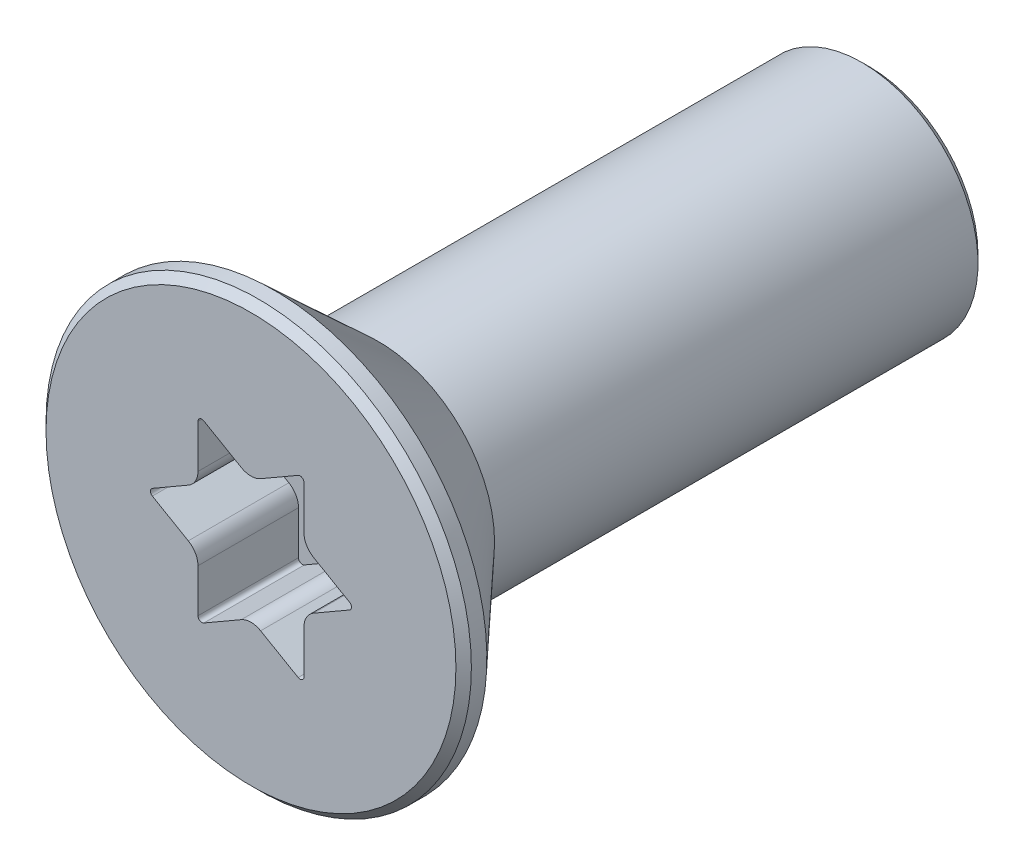
ISO-10303-21;
HEADER;
FILE_DESCRIPTION(('STEP AP214'),'2;1');
FILE_NAME('part.step','',(''),(''),'','','');
FILE_SCHEMA(('AUTOMOTIVE_DESIGN { 1 0 10303 214 1 1 1 1 }'));
ENDSEC;
DATA;
#1=APPLICATION_CONTEXT('core data for automotive mechanical design processes');
#2=APPLICATION_PROTOCOL_DEFINITION('international standard','automotive_design',2000,#1);
#3=PRODUCT_CONTEXT('',#1,'mechanical');
#4=PRODUCT('Part','Part','',(#3));
#5=PRODUCT_RELATED_PRODUCT_CATEGORY('part','',(#4));
#6=PRODUCT_DEFINITION_FORMATION('','',#4);
#7=PRODUCT_DEFINITION_CONTEXT('part definition',#1,'design');
#8=PRODUCT_DEFINITION('design','',#6,#7);
#9=PRODUCT_DEFINITION_SHAPE('','',#8);
#10=(LENGTH_UNIT() NAMED_UNIT(*) SI_UNIT(.MILLI.,.METRE.));
#11=(NAMED_UNIT(*) PLANE_ANGLE_UNIT() SI_UNIT($,.RADIAN.));
#12=(NAMED_UNIT(*) SI_UNIT($,.STERADIAN.) SOLID_ANGLE_UNIT());
#13=UNCERTAINTY_MEASURE_WITH_UNIT(LENGTH_MEASURE(1.E-05),#10,'distance_accuracy_value','');
#14=(GEOMETRIC_REPRESENTATION_CONTEXT(3) GLOBAL_UNCERTAINTY_ASSIGNED_CONTEXT((#13)) GLOBAL_UNIT_ASSIGNED_CONTEXT((#10,
#11,#12)) REPRESENTATION_CONTEXT('',''));
#15=CARTESIAN_POINT('',(0.,0.,0.));
#16=DIRECTION('',(0.,0.,1.));
#17=DIRECTION('',(1.,0.,0.));
#18=AXIS2_PLACEMENT_3D('',#15,#16,#17);
#19=CARTESIAN_POINT('',(7.2,-9.399999999999,97.45));
#20=DIRECTION('',(0.,0.,1.));
#21=DIRECTION('',(1.,0.,0.));
#22=AXIS2_PLACEMENT_3D('',#19,#20,#21);
#23=PLANE('',#22);
#24=CARTESIAN_POINT('',(7.2,-8.331902001999,97.45));
#25=DIRECTION('',(0.,0.,1.));
#26=DIRECTION('',(1.,0.,0.));
#27=AXIS2_PLACEMENT_3D('',#24,#25,#26);
#28=CIRCLE('',#27,0.25);
#29=CARTESIAN_POINT('',(7.07499999999906,-8.54840835294442,97.45));
#30=VERTEX_POINT('',#29);
#31=CARTESIAN_POINT('',(7.32500000000035,-8.54840835294476,97.45));
#32=VERTEX_POINT('',#31);
#33=EDGE_CURVE('E252',#30,#32,#28,.T.);
#34=ORIENTED_EDGE('',*,*,#33,.F.);
#35=DIRECTION('',(-0.866025403784386,0.500000000000092,0.));
#36=VECTOR('',#35,1.);
#37=CARTESIAN_POINT('',(6.832420150552,-8.408354811566,97.45));
#38=LINE('',#37,#36);
#39=CARTESIAN_POINT('',(6.58984030110506,-8.26830127018779,97.45));
#40=VERTEX_POINT('',#39);
#41=EDGE_CURVE('E348',#30,#40,#38,.T.);
#42=ORIENTED_EDGE('',*,*,#41,.T.);
#43=CARTESIAN_POINT('',(6.564840301107,-8.311602540378,97.45));
#44=DIRECTION('',(0.,0.,1.));
#45=DIRECTION('',(1.,0.,0.));
#46=AXIS2_PLACEMENT_3D('',#43,#44,#45);
#47=CIRCLE('',#46,0.05);
#48=CARTESIAN_POINT('',(6.514840301107,-8.3116025391075,97.45));
#49=VERTEX_POINT('',#48);
#50=EDGE_CURVE('E248',#40,#49,#47,.T.);
#51=ORIENTED_EDGE('',*,*,#50,.T.);
#52=DIRECTION('',(0.,1.,0.));
#53=VECTOR('',#52,1.);
#54=CARTESIAN_POINT('',(6.514840301107,-8.59170961551,97.45));
#55=LINE('',#54,#53);
#56=CARTESIAN_POINT('',(6.514840301107,-8.871816705891,97.45));
#57=VERTEX_POINT('',#56);
#58=EDGE_CURVE('E251',#57,#49,#55,.T.);
#59=ORIENTED_EDGE('',*,*,#58,.F.);
#60=CARTESIAN_POINT('',(6.264840301107,-8.871816705891,97.45));
#61=DIRECTION('',(0.,0.,1.));
#62=DIRECTION('',(1.,0.,0.));
#63=AXIS2_PLACEMENT_3D('',#60,#61,#62);
#64=CIRCLE('',#63,0.25);
#65=CARTESIAN_POINT('',(6.38984030110702,-9.08832305683717,97.45));
#66=VERTEX_POINT('',#65);
#67=EDGE_CURVE('E244',#66,#57,#64,.T.);
#68=ORIENTED_EDGE('',*,*,#67,.F.);
#69=DIRECTION('',(-0.866025403784609,-0.499999999999705,0.));
#70=VECTOR('',#69,1.);
#71=CARTESIAN_POINT('',(6.157420150554,-9.222510893324,97.45));
#72=LINE('',#71,#70);
#73=CARTESIAN_POINT('',(5.9250000000002,-9.35669872981122,97.45));
#74=VERTEX_POINT('',#73);
#75=EDGE_CURVE('E343',#66,#74,#72,.T.);
#76=ORIENTED_EDGE('',*,*,#75,.T.);
#77=CARTESIAN_POINT('',(5.95,-9.4,97.45));
#78=DIRECTION('',(0.,0.,1.));
#79=DIRECTION('',(1.,0.,0.));
#80=AXIS2_PLACEMENT_3D('',#77,#78,#79);
#81=CIRCLE('',#80,0.05);
#82=CARTESIAN_POINT('',(5.92500000000008,-9.44330127018899,97.45));
#83=VERTEX_POINT('',#82);
#84=EDGE_CURVE('E240',#74,#83,#81,.T.);
#85=ORIENTED_EDGE('',*,*,#84,.T.);
#86=DIRECTION('',(-0.866025403784609,0.499999999999705,0.));
#87=VECTOR('',#86,1.);
#88=CARTESIAN_POINT('',(6.157420150554,-9.577489106676,97.45));
#89=LINE('',#88,#87);
#90=CARTESIAN_POINT('',(6.38984030110704,-9.71167694316279,97.45));
#91=VERTEX_POINT('',#90);
#92=EDGE_CURVE('E243',#91,#83,#89,.T.);
#93=ORIENTED_EDGE('',*,*,#92,.F.);
#94=CARTESIAN_POINT('',(6.264840301107,-9.928183294109,97.45));
#95=DIRECTION('',(0.,0.,1.));
#96=DIRECTION('',(1.,0.,0.));
#97=AXIS2_PLACEMENT_3D('',#94,#95,#96);
#98=CIRCLE('',#97,0.250000000001);
#99=CARTESIAN_POINT('',(6.5148403011075,-9.928183294109,97.45));
#100=VERTEX_POINT('',#99);
#101=EDGE_CURVE('E236',#100,#91,#98,.T.);
#102=ORIENTED_EDGE('',*,*,#101,.F.);
#103=DIRECTION('',(0.,1.,0.));
#104=VECTOR('',#103,1.);
#105=CARTESIAN_POINT('',(6.514840301107,-10.20829038449,97.45));
#106=LINE('',#105,#104);
#107=CARTESIAN_POINT('',(6.514840301107,-10.48839745962,97.45));
#108=VERTEX_POINT('',#107);
#109=EDGE_CURVE('E338',#108,#100,#106,.T.);
#110=ORIENTED_EDGE('',*,*,#109,.F.);
#111=CARTESIAN_POINT('',(6.564840301107,-10.48839745962,97.45));
#112=DIRECTION('',(0.,0.,1.));
#113=DIRECTION('',(1.,0.,0.));
#114=AXIS2_PLACEMENT_3D('',#111,#112,#113);
#115=CIRCLE('',#114,0.05);
#116=CARTESIAN_POINT('',(6.58984030110502,-10.5316987298094,97.45));
#117=VERTEX_POINT('',#116);
#118=EDGE_CURVE('E232',#108,#117,#115,.T.);
#119=ORIENTED_EDGE('',*,*,#118,.T.);
#120=DIRECTION('',(-0.86602540378219,-0.500000000003894,0.));
#121=VECTOR('',#120,1.);
#122=CARTESIAN_POINT('',(6.83242015055,-10.39164518843,97.45));
#123=LINE('',#122,#121);
#124=CARTESIAN_POINT('',(7.07499999999478,-10.2515916470516,97.45));
#125=VERTEX_POINT('',#124);
#126=EDGE_CURVE('E235',#125,#117,#123,.T.);
#127=ORIENTED_EDGE('',*,*,#126,.F.);
#128=CARTESIAN_POINT('',(7.2,-10.468097998,97.45));
#129=DIRECTION('',(0.,0.,1.));
#130=DIRECTION('',(1.,0.,0.));
#131=AXIS2_PLACEMENT_3D('',#128,#129,#130);
#132=CIRCLE('',#131,0.25);
#133=CARTESIAN_POINT('',(7.3250000000037,-10.2515916470534,97.45));
#134=VERTEX_POINT('',#133);
#135=EDGE_CURVE('E228',#134,#125,#132,.T.);
#136=ORIENTED_EDGE('',*,*,#135,.F.);
#137=DIRECTION('',(-0.86602540378219,0.500000000003894,0.));
#138=VECTOR('',#137,1.);
#139=CARTESIAN_POINT('',(7.56757984945,-10.39164518843,97.45));
#140=LINE('',#139,#138);
#141=CARTESIAN_POINT('',(7.81015969889538,-10.5316987298087,97.45));
#142=VERTEX_POINT('',#141);
#143=EDGE_CURVE('E333',#142,#134,#140,.T.);
#144=ORIENTED_EDGE('',*,*,#143,.F.);
#145=CARTESIAN_POINT('',(7.835159698893,-10.48839745962,97.45));
#146=DIRECTION('',(0.,0.,1.));
#147=DIRECTION('',(1.,0.,0.));
#148=AXIS2_PLACEMENT_3D('',#145,#146,#147);
#149=CIRCLE('',#148,0.05);
#150=CARTESIAN_POINT('',(7.885159698893,-10.48839748249,97.45));
#151=VERTEX_POINT('',#150);
#152=EDGE_CURVE('E221',#142,#151,#149,.T.);
#153=ORIENTED_EDGE('',*,*,#152,.T.);
#154=DIRECTION('',(0.,1.,0.));
#155=VECTOR('',#154,1.);
#156=CARTESIAN_POINT('',(7.885159698893,-10.20829038449,97.45));
#157=LINE('',#156,#155);
#158=CARTESIAN_POINT('',(7.885159698893,-9.928183294109,97.45));
#159=VERTEX_POINT('',#158);
#160=EDGE_CURVE('E219',#151,#159,#157,.T.);
#161=ORIENTED_EDGE('',*,*,#160,.T.);
#162=CARTESIAN_POINT('',(8.135159698893,-9.928183294109,97.45));
#163=DIRECTION('',(0.,0.,1.));
#164=DIRECTION('',(1.,0.,0.));
#165=AXIS2_PLACEMENT_3D('',#162,#163,#164);
#166=CIRCLE('',#165,0.250000000001);
#167=CARTESIAN_POINT('',(8.0101596988927,-9.71167694316271,97.45));
#168=VERTEX_POINT('',#167);
#169=EDGE_CURVE('E216',#168,#159,#166,.T.);
#170=ORIENTED_EDGE('',*,*,#169,.F.);
#171=DIRECTION('',(-0.866025403784609,-0.499999999999705,0.));
#172=VECTOR('',#171,1.);
#173=CARTESIAN_POINT('',(8.242579849447,-9.577489106676,97.45));
#174=LINE('',#173,#172);
#175=CARTESIAN_POINT('',(8.47500000000005,-9.44330127018921,97.45));
#176=VERTEX_POINT('',#175);
#177=EDGE_CURVE('E329',#176,#168,#174,.T.);
#178=ORIENTED_EDGE('',*,*,#177,.F.);
#179=CARTESIAN_POINT('',(8.45,-9.4,97.45));
#180=DIRECTION('',(0.,0.,1.));
#181=DIRECTION('',(1.,0.,0.));
#182=AXIS2_PLACEMENT_3D('',#179,#180,#181);
#183=CIRCLE('',#182,0.05);
#184=CARTESIAN_POINT('',(8.47499999999992,-9.35669872981101,97.45));
#185=VERTEX_POINT('',#184);
#186=EDGE_CURVE('E212',#176,#185,#183,.T.);
#187=ORIENTED_EDGE('',*,*,#186,.T.);
#188=DIRECTION('',(-0.866025403784609,0.499999999999705,0.));
#189=VECTOR('',#188,1.);
#190=CARTESIAN_POINT('',(8.242579849446,-9.222510893324,97.45));
#191=LINE('',#190,#189);
#192=CARTESIAN_POINT('',(8.01015969889296,-9.08832305683721,97.45));
#193=VERTEX_POINT('',#192);
#194=EDGE_CURVE('E211',#185,#193,#191,.T.);
#195=ORIENTED_EDGE('',*,*,#194,.T.);
#196=CARTESIAN_POINT('',(8.135159698893,-8.871816705891,97.45));
#197=DIRECTION('',(0.,0.,1.));
#198=DIRECTION('',(1.,0.,0.));
#199=AXIS2_PLACEMENT_3D('',#196,#197,#198);
#200=CIRCLE('',#199,0.25);
#201=CARTESIAN_POINT('',(7.885159698893,-8.871816705891,97.45));
#202=VERTEX_POINT('',#201);
#203=EDGE_CURVE('E199',#202,#193,#200,.T.);
#204=ORIENTED_EDGE('',*,*,#203,.F.);
#205=DIRECTION('',(0.,1.,0.));
#206=VECTOR('',#205,1.);
#207=CARTESIAN_POINT('',(7.885159698893,-8.591709615511,97.45));
#208=LINE('',#207,#206);
#209=CARTESIAN_POINT('',(7.885159698893,-8.311602528942,97.45));
#210=VERTEX_POINT('',#209);
#211=EDGE_CURVE('E197',#202,#210,#208,.T.);
#212=ORIENTED_EDGE('',*,*,#211,.T.);
#213=CARTESIAN_POINT('',(7.835159698893,-8.311602540378,97.45));
#214=DIRECTION('',(0.,0.,1.));
#215=DIRECTION('',(1.,0.,0.));
#216=AXIS2_PLACEMENT_3D('',#213,#214,#215);
#217=CIRCLE('',#216,0.05);
#218=CARTESIAN_POINT('',(7.81015969889513,-8.26830127018762,97.45));
#219=VERTEX_POINT('',#218);
#220=EDGE_CURVE('E19',#210,#219,#217,.T.);
#221=ORIENTED_EDGE('',*,*,#220,.T.);
#222=DIRECTION('',(-0.866025403784386,-0.500000000000092,0.));
#223=VECTOR('',#222,1.);
#224=CARTESIAN_POINT('',(7.567579849448,-8.408354811566,97.45));
#225=LINE('',#224,#223);
#226=EDGE_CURVE('E195',#219,#32,#225,.T.);
#227=ORIENTED_EDGE('',*,*,#226,.T.);
#228=EDGE_LOOP('',(#34,#42,#51,#59,#68,#76,#85,#93,#102,#110,#119,#127,#136,#144,#153,#161,#170,
#178,#187,#195,#204,#212,#221,#227));
#229=FACE_BOUND('',#228,.T.);
#230=ADVANCED_FACE('F16',(#229),#23,.T.);
#231=CARTESIAN_POINT('',(7.567579849448,-8.408354811566,98.1));
#232=DIRECTION('',(-0.500000000000092,0.866025403784386,0.));
#233=DIRECTION('',(-0.866025403784386,-0.500000000000092,0.));
#234=AXIS2_PLACEMENT_3D('',#231,#232,#233);
#235=PLANE('',#234);
#236=ORIENTED_EDGE('',*,*,#226,.F.);
#237=DIRECTION('',(0.,0.,1.));
#238=VECTOR('',#237,1.);
#239=CARTESIAN_POINT('',(7.8101596988972,-8.26830127018635,97.424));
#240=LINE('',#239,#238);
#241=CARTESIAN_POINT('',(7.81015969889516,-8.26830127018766,98.75));
#242=VERTEX_POINT('',#241);
#243=EDGE_CURVE('E194',#219,#242,#240,.T.);
#244=ORIENTED_EDGE('',*,*,#243,.T.);
#245=DIRECTION('',(0.866025403784549,0.499999999999809,0.));
#246=VECTOR('',#245,1.);
#247=CARTESIAN_POINT('',(7.325000000003,-8.548408352943,98.75));
#248=LINE('',#247,#246);
#249=CARTESIAN_POINT('',(7.32500000000029,-8.54840835294475,98.75));
#250=VERTEX_POINT('',#249);
#251=EDGE_CURVE('E259',#250,#242,#248,.T.);
#252=ORIENTED_EDGE('',*,*,#251,.F.);
#253=DIRECTION('',(0.,0.,1.));
#254=VECTOR('',#253,1.);
#255=CARTESIAN_POINT('',(7.3250000000008,-8.54840835294465,97.424));
#256=LINE('',#255,#254);
#257=EDGE_CURVE('E255',#32,#250,#256,.T.);
#258=ORIENTED_EDGE('',*,*,#257,.F.);
#259=EDGE_LOOP('',(#236,#244,#252,#258));
#260=FACE_BOUND('',#259,.T.);
#261=ADVANCED_FACE('F743',(#260),#235,.F.);
#262=CARTESIAN_POINT('',(7.835159698893,-8.311602540378,97.424));
#263=DIRECTION('',(0.,0.,1.));
#264=DIRECTION('',(1.,0.,0.));
#265=AXIS2_PLACEMENT_3D('',#262,#263,#264);
#266=CYLINDRICAL_SURFACE('',#265,0.05);
#267=ORIENTED_EDGE('',*,*,#220,.F.);
#268=DIRECTION('',(0.,0.,-1.));
#269=VECTOR('',#268,1.);
#270=CARTESIAN_POINT('',(7.885159698893,-8.311602517506,98.1));
#271=LINE('',#270,#269);
#272=CARTESIAN_POINT('',(7.885159698893,-8.311602528942,98.75));
#273=VERTEX_POINT('',#272);
#274=EDGE_CURVE('E191',#210,#273,#271,.F.);
#275=ORIENTED_EDGE('',*,*,#274,.T.);
#276=CARTESIAN_POINT('',(7.835159698893,-8.311602540378,98.75));
#277=DIRECTION('',(0.,0.,1.));
#278=DIRECTION('',(1.,0.,0.));
#279=AXIS2_PLACEMENT_3D('',#276,#277,#278);
#280=CIRCLE('',#279,0.05);
#281=EDGE_CURVE('E257',#242,#273,#280,.F.);
#282=ORIENTED_EDGE('',*,*,#281,.F.);
#283=ORIENTED_EDGE('',*,*,#243,.F.);
#284=EDGE_LOOP('',(#267,#275,#282,#283));
#285=FACE_BOUND('',#284,.T.);
#286=ADVANCED_FACE('F189',(#285),#266,.F.);
#287=CARTESIAN_POINT('',(7.885159698893,-8.591709615511,98.1));
#288=DIRECTION('',(1.,0.,0.));
#289=DIRECTION('',(0.,0.,-1.));
#290=AXIS2_PLACEMENT_3D('',#287,#288,#289);
#291=PLANE('',#290);
#292=ORIENTED_EDGE('',*,*,#211,.F.);
#293=DIRECTION('',(0.,0.,1.));
#294=VECTOR('',#293,1.);
#295=CARTESIAN_POINT('',(7.885159698893,-8.871816705891,97.424));
#296=LINE('',#295,#294);
#297=CARTESIAN_POINT('',(7.885159698893,-8.871816705891,98.75));
#298=VERTEX_POINT('',#297);
#299=EDGE_CURVE('E207',#298,#202,#296,.F.);
#300=ORIENTED_EDGE('',*,*,#299,.F.);
#301=DIRECTION('',(0.,1.,0.));
#302=VECTOR('',#301,1.);
#303=CARTESIAN_POINT('',(7.885159698893,-9.4,98.75));
#304=LINE('',#303,#302);
#305=EDGE_CURVE('E205',#273,#298,#304,.F.);
#306=ORIENTED_EDGE('',*,*,#305,.F.);
#307=ORIENTED_EDGE('',*,*,#274,.F.);
#308=EDGE_LOOP('',(#292,#300,#306,#307));
#309=FACE_BOUND('',#308,.T.);
#310=ADVANCED_FACE('F203',(#309),#291,.F.);
#311=CARTESIAN_POINT('',(8.135159698893,-8.871816705891,97.424));
#312=DIRECTION('',(0.,0.,1.));
#313=DIRECTION('',(1.,0.,0.));
#314=AXIS2_PLACEMENT_3D('',#311,#312,#313);
#315=CYLINDRICAL_SURFACE('',#314,0.25);
#316=DIRECTION('',(0.,0.,1.));
#317=VECTOR('',#316,1.);
#318=CARTESIAN_POINT('',(8.0101596988929,-9.08832305683718,98.1));
#319=LINE('',#318,#317);
#320=CARTESIAN_POINT('',(8.01015969889303,-9.08832305683713,98.75));
#321=VERTEX_POINT('',#320);
#322=EDGE_CURVE('E215',#193,#321,#319,.T.);
#323=ORIENTED_EDGE('',*,*,#322,.T.);
#324=CARTESIAN_POINT('',(8.135159698893,-8.871816705891,98.75));
#325=DIRECTION('',(0.,0.,1.));
#326=DIRECTION('',(1.,0.,0.));
#327=AXIS2_PLACEMENT_3D('',#324,#325,#326);
#328=CIRCLE('',#327,0.25);
#329=EDGE_CURVE('E260',#298,#321,#328,.T.);
#330=ORIENTED_EDGE('',*,*,#329,.F.);
#331=ORIENTED_EDGE('',*,*,#299,.T.);
#332=ORIENTED_EDGE('',*,*,#203,.T.);
#333=EDGE_LOOP('',(#323,#330,#331,#332));
#334=FACE_BOUND('',#333,.T.);
#335=ADVANCED_FACE('F716',(#334),#315,.T.);
#336=CARTESIAN_POINT('',(8.242579849446,-9.222510893324,98.1));
#337=DIRECTION('',(0.499999999999705,0.866025403784609,0.));
#338=DIRECTION('',(-0.866025403784609,0.499999999999705,0.));
#339=AXIS2_PLACEMENT_3D('',#336,#337,#338);
#340=PLANE('',#339);
#341=ORIENTED_EDGE('',*,*,#194,.F.);
#342=DIRECTION('',(0.,0.,1.));
#343=VECTOR('',#342,1.);
#344=CARTESIAN_POINT('',(8.4750000000001,-9.35669872981084,97.424));
#345=LINE('',#344,#343);
#346=CARTESIAN_POINT('',(8.47499999999999,-9.35669872981088,98.75));
#347=VERTEX_POINT('',#346);
#348=EDGE_CURVE('E214',#185,#347,#345,.T.);
#349=ORIENTED_EDGE('',*,*,#348,.T.);
#350=DIRECTION('',(0.866025403784691,-0.499999999999564,0.));
#351=VECTOR('',#350,1.);
#352=CARTESIAN_POINT('',(8.010159698893,-9.088323056837,98.75));
#353=LINE('',#352,#351);
#354=EDGE_CURVE('E263',#321,#347,#353,.T.);
#355=ORIENTED_EDGE('',*,*,#354,.F.);
#356=ORIENTED_EDGE('',*,*,#322,.F.);
#357=EDGE_LOOP('',(#341,#349,#355,#356));
#358=FACE_BOUND('',#357,.T.);
#359=ADVANCED_FACE('F706',(#358),#340,.F.);
#360=CARTESIAN_POINT('',(8.45,-9.4,97.424));
#361=DIRECTION('',(0.,0.,1.));
#362=DIRECTION('',(1.,0.,0.));
#363=AXIS2_PLACEMENT_3D('',#360,#361,#362);
#364=CYLINDRICAL_SURFACE('',#363,0.05);
#365=ORIENTED_EDGE('',*,*,#186,.F.);
#366=DIRECTION('',(0.,0.,1.));
#367=VECTOR('',#366,1.);
#368=CARTESIAN_POINT('',(8.4750000000001,-9.44330127018918,98.1));
#369=LINE('',#368,#367);
#370=CARTESIAN_POINT('',(8.47499999999994,-9.44330127018915,98.75));
#371=VERTEX_POINT('',#370);
#372=EDGE_CURVE('E331',#371,#176,#369,.F.);
#373=ORIENTED_EDGE('',*,*,#372,.F.);
#374=CARTESIAN_POINT('',(8.45,-9.4,98.75));
#375=DIRECTION('',(0.,0.,1.));
#376=DIRECTION('',(1.,0.,0.));
#377=AXIS2_PLACEMENT_3D('',#374,#375,#376);
#378=CIRCLE('',#377,0.05);
#379=EDGE_CURVE('E264',#347,#371,#378,.F.);
#380=ORIENTED_EDGE('',*,*,#379,.F.);
#381=ORIENTED_EDGE('',*,*,#348,.F.);
#382=EDGE_LOOP('',(#365,#373,#380,#381));
#383=FACE_BOUND('',#382,.T.);
#384=ADVANCED_FACE('F696',(#383),#364,.F.);
#385=CARTESIAN_POINT('',(8.242579849447,-9.577489106676,98.1));
#386=DIRECTION('',(-0.499999999999705,0.866025403784609,0.));
#387=DIRECTION('',(-0.866025403784609,-0.499999999999705,0.));
#388=AXIS2_PLACEMENT_3D('',#385,#386,#387);
#389=PLANE('',#388);
#390=DIRECTION('',(0.,0.,1.));
#391=VECTOR('',#390,1.);
#392=CARTESIAN_POINT('',(8.01015969889214,-9.71167694316224,97.424));
#393=LINE('',#392,#391);
#394=CARTESIAN_POINT('',(8.01015969889258,-9.71167694316182,98.75));
#395=VERTEX_POINT('',#394);
#396=EDGE_CURVE('E220',#395,#168,#393,.F.);
#397=ORIENTED_EDGE('',*,*,#396,.F.);
#398=DIRECTION('',(-0.866025403785964,-0.499999999997359,0.));
#399=VECTOR('',#398,1.);
#400=CARTESIAN_POINT('',(8.475,-9.443301270189,98.75));
#401=LINE('',#400,#399);
#402=EDGE_CURVE('E267',#371,#395,#401,.T.);
#403=ORIENTED_EDGE('',*,*,#402,.F.);
#404=ORIENTED_EDGE('',*,*,#372,.T.);
#405=ORIENTED_EDGE('',*,*,#177,.T.);
#406=EDGE_LOOP('',(#397,#403,#404,#405));
#407=FACE_BOUND('',#406,.T.);
#408=ADVANCED_FACE('F686',(#407),#389,.T.);
#409=CARTESIAN_POINT('',(8.135159698893,-9.928183294109,97.424));
#410=DIRECTION('',(0.,0.,1.));
#411=DIRECTION('',(1.,0.,0.));
#412=AXIS2_PLACEMENT_3D('',#409,#410,#411);
#413=CYLINDRICAL_SURFACE('',#412,0.250000000001);
#414=DIRECTION('',(0.,0.,-1.));
#415=VECTOR('',#414,1.);
#416=CARTESIAN_POINT('',(7.885159698893,-9.928183294109,98.1));
#417=LINE('',#416,#415);
#418=CARTESIAN_POINT('',(7.885159698893,-9.928183294109,98.75));
#419=VERTEX_POINT('',#418);
#420=EDGE_CURVE('E224',#159,#419,#417,.F.);
#421=ORIENTED_EDGE('',*,*,#420,.T.);
#422=CARTESIAN_POINT('',(8.135159698893,-9.928183294109,98.75));
#423=DIRECTION('',(0.,0.,1.));
#424=DIRECTION('',(1.,0.,0.));
#425=AXIS2_PLACEMENT_3D('',#422,#423,#424);
#426=CIRCLE('',#425,0.250000000001);
#427=EDGE_CURVE('E268',#395,#419,#426,.T.);
#428=ORIENTED_EDGE('',*,*,#427,.F.);
#429=ORIENTED_EDGE('',*,*,#396,.T.);
#430=ORIENTED_EDGE('',*,*,#169,.T.);
#431=EDGE_LOOP('',(#421,#428,#429,#430));
#432=FACE_BOUND('',#431,.T.);
#433=ADVANCED_FACE('F676',(#432),#413,.T.);
#434=CARTESIAN_POINT('',(7.885159698893,-10.20829038449,98.1));
#435=DIRECTION('',(1.,0.,0.));
#436=DIRECTION('',(0.,0.,-1.));
#437=AXIS2_PLACEMENT_3D('',#434,#435,#436);
#438=PLANE('',#437);
#439=ORIENTED_EDGE('',*,*,#160,.F.);
#440=DIRECTION('',(0.,0.,-1.));
#441=VECTOR('',#440,1.);
#442=CARTESIAN_POINT('',(7.885159698893,-10.48839750536,98.1));
#443=LINE('',#442,#441);
#444=CARTESIAN_POINT('',(7.885159698893,-10.48839748249,98.75));
#445=VERTEX_POINT('',#444);
#446=EDGE_CURVE('E223',#151,#445,#443,.F.);
#447=ORIENTED_EDGE('',*,*,#446,.T.);
#448=DIRECTION('',(0.,1.,0.));
#449=VECTOR('',#448,1.);
#450=CARTESIAN_POINT('',(7.885159698893,-9.4,98.75));
#451=LINE('',#450,#449);
#452=EDGE_CURVE('E271',#419,#445,#451,.F.);
#453=ORIENTED_EDGE('',*,*,#452,.F.);
#454=ORIENTED_EDGE('',*,*,#420,.F.);
#455=EDGE_LOOP('',(#439,#447,#453,#454));
#456=FACE_BOUND('',#455,.T.);
#457=ADVANCED_FACE('F666',(#456),#438,.F.);
#458=CARTESIAN_POINT('',(7.835159698893,-10.48839745962,97.424));
#459=DIRECTION('',(0.,0.,1.));
#460=DIRECTION('',(1.,0.,0.));
#461=AXIS2_PLACEMENT_3D('',#458,#459,#460);
#462=CYLINDRICAL_SURFACE('',#461,0.05);
#463=ORIENTED_EDGE('',*,*,#152,.F.);
#464=DIRECTION('',(0.,0.,1.));
#465=VECTOR('',#464,1.);
#466=CARTESIAN_POINT('',(7.81015969889715,-10.5316987298097,98.1));
#467=LINE('',#466,#465);
#468=CARTESIAN_POINT('',(7.81015969889564,-10.531698729809,98.75));
#469=VERTEX_POINT('',#468);
#470=EDGE_CURVE('E227',#469,#142,#467,.F.);
#471=ORIENTED_EDGE('',*,*,#470,.F.);
#472=CARTESIAN_POINT('',(7.835159698893,-10.48839745962,98.75));
#473=DIRECTION('',(0.,0.,1.));
#474=DIRECTION('',(1.,0.,0.));
#475=AXIS2_PLACEMENT_3D('',#472,#473,#474);
#476=CIRCLE('',#475,0.05);
#477=EDGE_CURVE('E272',#445,#469,#476,.F.);
#478=ORIENTED_EDGE('',*,*,#477,.F.);
#479=ORIENTED_EDGE('',*,*,#446,.F.);
#480=EDGE_LOOP('',(#463,#471,#478,#479));
#481=FACE_BOUND('',#480,.T.);
#482=ADVANCED_FACE('F656',(#481),#462,.F.);
#483=CARTESIAN_POINT('',(7.56757984945,-10.39164518843,98.1));
#484=DIRECTION('',(0.500000000003894,0.86602540378219,0.));
#485=DIRECTION('',(-0.86602540378219,0.500000000003894,0.));
#486=AXIS2_PLACEMENT_3D('',#483,#484,#485);
#487=PLANE('',#486);
#488=DIRECTION('',(0.,0.,1.));
#489=VECTOR('',#488,1.);
#490=CARTESIAN_POINT('',(7.32500000000415,-10.2515916470563,97.424));
#491=LINE('',#490,#489);
#492=CARTESIAN_POINT('',(7.32499999999983,-10.2515916470563,98.75));
#493=VERTEX_POINT('',#492);
#494=EDGE_CURVE('E231',#493,#134,#491,.F.);
#495=ORIENTED_EDGE('',*,*,#494,.F.);
#496=DIRECTION('',(-0.866025403789839,0.499999999990647,0.));
#497=VECTOR('',#496,1.);
#498=CARTESIAN_POINT('',(7.810159698897,-10.53169872981,98.75));
#499=LINE('',#498,#497);
#500=EDGE_CURVE('E275',#469,#493,#499,.T.);
#501=ORIENTED_EDGE('',*,*,#500,.F.);
#502=ORIENTED_EDGE('',*,*,#470,.T.);
#503=ORIENTED_EDGE('',*,*,#143,.T.);
#504=EDGE_LOOP('',(#495,#501,#502,#503));
#505=FACE_BOUND('',#504,.T.);
#506=ADVANCED_FACE('F646',(#505),#487,.T.);
#507=CARTESIAN_POINT('',(7.2,-10.468097998,97.424));
#508=DIRECTION('',(0.,0.,1.));
#509=DIRECTION('',(1.,0.,0.));
#510=AXIS2_PLACEMENT_3D('',#507,#508,#509);
#511=CYLINDRICAL_SURFACE('',#510,0.25);
#512=CARTESIAN_POINT('',(7.2,-10.468097998,98.75));
#513=DIRECTION('',(0.,0.,1.));
#514=DIRECTION('',(1.,0.,0.));
#515=AXIS2_PLACEMENT_3D('',#512,#513,#514);
#516=CIRCLE('',#515,0.25);
#517=CARTESIAN_POINT('',(7.07499999999872,-10.2515916470542,98.75));
#518=VERTEX_POINT('',#517);
#519=EDGE_CURVE('E276',#493,#518,#516,.T.);
#520=ORIENTED_EDGE('',*,*,#519,.F.);
#521=ORIENTED_EDGE('',*,*,#494,.T.);
#522=ORIENTED_EDGE('',*,*,#135,.T.);
#523=DIRECTION('',(0.,0.,1.));
#524=VECTOR('',#523,1.);
#525=CARTESIAN_POINT('',(7.07499999999282,-10.2515916470528,98.1));
#526=LINE('',#525,#524);
#527=EDGE_CURVE('E230',#518,#125,#526,.F.);
#528=ORIENTED_EDGE('',*,*,#527,.F.);
#529=EDGE_LOOP('',(#520,#521,#522,#528));
#530=FACE_BOUND('',#529,.T.);
#531=ADVANCED_FACE('F636',(#530),#511,.T.);
#532=CARTESIAN_POINT('',(6.83242015055,-10.39164518843,98.1));
#533=DIRECTION('',(-0.500000000003894,0.86602540378219,0.));
#534=DIRECTION('',(-0.86602540378219,-0.500000000003894,0.));
#535=AXIS2_PLACEMENT_3D('',#532,#533,#534);
#536=PLANE('',#535);
#537=DIRECTION('',(0.,0.,1.));
#538=VECTOR('',#537,1.);
#539=CARTESIAN_POINT('',(6.58984030110366,-10.5316987298111,97.424));
#540=LINE('',#539,#538);
#541=CARTESIAN_POINT('',(6.58984030110435,-10.5316987298091,98.75));
#542=VERTEX_POINT('',#541);
#543=EDGE_CURVE('E234',#117,#542,#540,.T.);
#544=ORIENTED_EDGE('',*,*,#543,.T.);
#545=DIRECTION('',(-0.866025403790732,-0.4999999999891,0.));
#546=VECTOR('',#545,1.);
#547=CARTESIAN_POINT('',(7.074999999997,-10.25159164706,98.75));
#548=LINE('',#547,#546);
#549=EDGE_CURVE('E279',#518,#542,#548,.T.);
#550=ORIENTED_EDGE('',*,*,#549,.F.);
#551=ORIENTED_EDGE('',*,*,#527,.T.);
#552=ORIENTED_EDGE('',*,*,#126,.T.);
#553=EDGE_LOOP('',(#544,#550,#551,#552));
#554=FACE_BOUND('',#553,.T.);
#555=ADVANCED_FACE('F626',(#554),#536,.T.);
#556=CARTESIAN_POINT('',(6.564840301107,-10.48839745962,97.424));
#557=DIRECTION('',(0.,0.,1.));
#558=DIRECTION('',(1.,0.,0.));
#559=AXIS2_PLACEMENT_3D('',#556,#557,#558);
#560=CYLINDRICAL_SURFACE('',#559,0.05);
#561=ORIENTED_EDGE('',*,*,#118,.F.);
#562=DIRECTION('',(0.,0.,-1.));
#563=VECTOR('',#562,1.);
#564=CARTESIAN_POINT('',(6.514840301107,-10.48839745962,98.1));
#565=LINE('',#564,#563);
#566=CARTESIAN_POINT('',(6.514840301107,-10.48839745962,98.75));
#567=VERTEX_POINT('',#566);
#568=EDGE_CURVE('E340',#567,#108,#565,.T.);
#569=ORIENTED_EDGE('',*,*,#568,.F.);
#570=CARTESIAN_POINT('',(6.564840301107,-10.48839745962,98.75));
#571=DIRECTION('',(0.,0.,1.));
#572=DIRECTION('',(1.,0.,0.));
#573=AXIS2_PLACEMENT_3D('',#570,#571,#572);
#574=CIRCLE('',#573,0.05);
#575=EDGE_CURVE('E280',#542,#567,#574,.F.);
#576=ORIENTED_EDGE('',*,*,#575,.F.);
#577=ORIENTED_EDGE('',*,*,#543,.F.);
#578=EDGE_LOOP('',(#561,#569,#576,#577));
#579=FACE_BOUND('',#578,.T.);
#580=ADVANCED_FACE('F616',(#579),#560,.F.);
#581=CARTESIAN_POINT('',(6.514840301107,-10.20829038449,98.1));
#582=DIRECTION('',(1.,0.,0.));
#583=DIRECTION('',(0.,0.,-1.));
#584=AXIS2_PLACEMENT_3D('',#581,#582,#583);
#585=PLANE('',#584);
#586=DIRECTION('',(0.,0.,1.));
#587=VECTOR('',#586,1.);
#588=CARTESIAN_POINT('',(6.514840301108,-9.928183294109,97.424));
#589=LINE('',#588,#587);
#590=CARTESIAN_POINT('',(6.5148403011075,-9.928183294109,98.75));
#591=VERTEX_POINT('',#590);
#592=EDGE_CURVE('E239',#591,#100,#589,.F.);
#593=ORIENTED_EDGE('',*,*,#592,.F.);
#594=DIRECTION('',(0.,1.,0.));
#595=VECTOR('',#594,1.);
#596=CARTESIAN_POINT('',(6.514840301107,-9.4,98.75));
#597=LINE('',#596,#595);
#598=EDGE_CURVE('E283',#567,#591,#597,.T.);
#599=ORIENTED_EDGE('',*,*,#598,.F.);
#600=ORIENTED_EDGE('',*,*,#568,.T.);
#601=ORIENTED_EDGE('',*,*,#109,.T.);
#602=EDGE_LOOP('',(#593,#599,#600,#601));
#603=FACE_BOUND('',#602,.T.);
#604=ADVANCED_FACE('F606',(#603),#585,.T.);
#605=CARTESIAN_POINT('',(6.264840301107,-9.928183294109,97.424));
#606=DIRECTION('',(0.,0.,1.));
#607=DIRECTION('',(1.,0.,0.));
#608=AXIS2_PLACEMENT_3D('',#605,#606,#607);
#609=CYLINDRICAL_SURFACE('',#608,0.250000000001);
#610=DIRECTION('',(0.,0.,1.));
#611=VECTOR('',#610,1.);
#612=CARTESIAN_POINT('',(6.3898403011071,-9.71167694316282,98.1));
#613=LINE('',#612,#611);
#614=CARTESIAN_POINT('',(6.38984030110697,-9.71167694316287,98.75));
#615=VERTEX_POINT('',#614);
#616=EDGE_CURVE('E238',#615,#91,#613,.F.);
#617=ORIENTED_EDGE('',*,*,#616,.F.);
#618=CARTESIAN_POINT('',(6.264840301107,-9.928183294109,98.75));
#619=DIRECTION('',(0.,0.,1.));
#620=DIRECTION('',(1.,0.,0.));
#621=AXIS2_PLACEMENT_3D('',#618,#619,#620);
#622=CIRCLE('',#621,0.250000000001);
#623=EDGE_CURVE('E284',#591,#615,#622,.T.);
#624=ORIENTED_EDGE('',*,*,#623,.F.);
#625=ORIENTED_EDGE('',*,*,#592,.T.);
#626=ORIENTED_EDGE('',*,*,#101,.T.);
#627=EDGE_LOOP('',(#617,#624,#625,#626));
#628=FACE_BOUND('',#627,.T.);
#629=ADVANCED_FACE('F596',(#628),#609,.T.);
#630=CARTESIAN_POINT('',(6.157420150554,-9.577489106676,98.1));
#631=DIRECTION('',(0.499999999999705,0.866025403784609,0.));
#632=DIRECTION('',(-0.866025403784609,0.499999999999705,0.));
#633=AXIS2_PLACEMENT_3D('',#630,#631,#632);
#634=PLANE('',#633);
#635=DIRECTION('',(0.,0.,1.));
#636=VECTOR('',#635,1.);
#637=CARTESIAN_POINT('',(5.9249999999999,-9.44330127018917,97.424));
#638=LINE('',#637,#636);
#639=CARTESIAN_POINT('',(5.92500000000001,-9.44330127018912,98.75));
#640=VERTEX_POINT('',#639);
#641=EDGE_CURVE('E242',#83,#640,#638,.T.);
#642=ORIENTED_EDGE('',*,*,#641,.T.);
#643=DIRECTION('',(-0.866025403784691,0.499999999999563,0.));
#644=VECTOR('',#643,1.);
#645=CARTESIAN_POINT('',(6.389840301107,-9.711676943163,98.75));
#646=LINE('',#645,#644);
#647=EDGE_CURVE('E287',#615,#640,#646,.T.);
#648=ORIENTED_EDGE('',*,*,#647,.F.);
#649=ORIENTED_EDGE('',*,*,#616,.T.);
#650=ORIENTED_EDGE('',*,*,#92,.T.);
#651=EDGE_LOOP('',(#642,#648,#649,#650));
#652=FACE_BOUND('',#651,.T.);
#653=ADVANCED_FACE('F586',(#652),#634,.T.);
#654=CARTESIAN_POINT('',(5.95,-9.4,97.424));
#655=DIRECTION('',(0.,0.,1.));
#656=DIRECTION('',(1.,0.,0.));
#657=AXIS2_PLACEMENT_3D('',#654,#655,#656);
#658=CYLINDRICAL_SURFACE('',#657,0.05);
#659=ORIENTED_EDGE('',*,*,#84,.F.);
#660=DIRECTION('',(0.,0.,1.));
#661=VECTOR('',#660,1.);
#662=CARTESIAN_POINT('',(5.92500000000015,-9.35669872981125,98.1));
#663=LINE('',#662,#661);
#664=CARTESIAN_POINT('',(5.92500000000013,-9.35669872981109,98.75));
#665=VERTEX_POINT('',#664);
#666=EDGE_CURVE('E345',#74,#665,#663,.T.);
#667=ORIENTED_EDGE('',*,*,#666,.T.);
#668=CARTESIAN_POINT('',(5.95,-9.4,98.75));
#669=DIRECTION('',(0.,0.,1.));
#670=DIRECTION('',(1.,0.,0.));
#671=AXIS2_PLACEMENT_3D('',#668,#669,#670);
#672=CIRCLE('',#671,0.05);
#673=EDGE_CURVE('E288',#640,#665,#672,.F.);
#674=ORIENTED_EDGE('',*,*,#673,.F.);
#675=ORIENTED_EDGE('',*,*,#641,.F.);
#676=EDGE_LOOP('',(#659,#667,#674,#675));
#677=FACE_BOUND('',#676,.T.);
#678=ADVANCED_FACE('F576',(#677),#658,.F.);
#679=CARTESIAN_POINT('',(6.157420150554,-9.222510893324,98.1));
#680=DIRECTION('',(-0.499999999999705,0.866025403784609,0.));
#681=DIRECTION('',(-0.866025403784609,-0.499999999999705,0.));
#682=AXIS2_PLACEMENT_3D('',#679,#680,#681);
#683=PLANE('',#682);
#684=ORIENTED_EDGE('',*,*,#75,.F.);
#685=DIRECTION('',(0.,0.,1.));
#686=VECTOR('',#685,1.);
#687=CARTESIAN_POINT('',(6.38984030110705,-9.08832305683708,97.424));
#688=LINE('',#687,#686);
#689=CARTESIAN_POINT('',(6.38984030110695,-9.08832305683709,98.75));
#690=VERTEX_POINT('',#689);
#691=EDGE_CURVE('E247',#690,#66,#688,.F.);
#692=ORIENTED_EDGE('',*,*,#691,.F.);
#693=DIRECTION('',(0.866025403784691,0.499999999999563,0.));
#694=VECTOR('',#693,1.);
#695=CARTESIAN_POINT('',(5.925,-9.356698729811,98.75));
#696=LINE('',#695,#694);
#697=EDGE_CURVE('E291',#665,#690,#696,.T.);
#698=ORIENTED_EDGE('',*,*,#697,.F.);
#699=ORIENTED_EDGE('',*,*,#666,.F.);
#700=EDGE_LOOP('',(#684,#692,#698,#699));
#701=FACE_BOUND('',#700,.T.);
#702=ADVANCED_FACE('F566',(#701),#683,.F.);
#703=CARTESIAN_POINT('',(6.264840301107,-8.871816705891,97.424));
#704=DIRECTION('',(0.,0.,1.));
#705=DIRECTION('',(1.,0.,0.));
#706=AXIS2_PLACEMENT_3D('',#703,#704,#705);
#707=CYLINDRICAL_SURFACE('',#706,0.25);
#708=DIRECTION('',(0.,0.,-1.));
#709=VECTOR('',#708,1.);
#710=CARTESIAN_POINT('',(6.514840301107,-8.871816705891,98.1));
#711=LINE('',#710,#709);
#712=CARTESIAN_POINT('',(6.514840301107,-8.871816705891,98.75));
#713=VERTEX_POINT('',#712);
#714=EDGE_CURVE('E246',#713,#57,#711,.T.);
#715=ORIENTED_EDGE('',*,*,#714,.F.);
#716=CARTESIAN_POINT('',(6.264840301107,-8.871816705891,98.75));
#717=DIRECTION('',(0.,0.,1.));
#718=DIRECTION('',(1.,0.,0.));
#719=AXIS2_PLACEMENT_3D('',#716,#717,#718);
#720=CIRCLE('',#719,0.25);
#721=EDGE_CURVE('E292',#690,#713,#720,.T.);
#722=ORIENTED_EDGE('',*,*,#721,.F.);
#723=ORIENTED_EDGE('',*,*,#691,.T.);
#724=ORIENTED_EDGE('',*,*,#67,.T.);
#725=EDGE_LOOP('',(#715,#722,#723,#724));
#726=FACE_BOUND('',#725,.T.);
#727=ADVANCED_FACE('F556',(#726),#707,.T.);
#728=CARTESIAN_POINT('',(6.514840301107,-8.59170961551,98.1));
#729=DIRECTION('',(1.,0.,0.));
#730=DIRECTION('',(0.,0.,-1.));
#731=AXIS2_PLACEMENT_3D('',#728,#729,#730);
#732=PLANE('',#731);
#733=DIRECTION('',(0.,0.,1.));
#734=VECTOR('',#733,1.);
#735=CARTESIAN_POINT('',(6.514840301107,-8.311602537837,97.424));
#736=LINE('',#735,#734);
#737=CARTESIAN_POINT('',(6.514840301107,-8.3116025391075,98.75));
#738=VERTEX_POINT('',#737);
#739=EDGE_CURVE('E250',#49,#738,#736,.T.);
#740=ORIENTED_EDGE('',*,*,#739,.T.);
#741=DIRECTION('',(0.,1.,0.));
#742=VECTOR('',#741,1.);
#743=CARTESIAN_POINT('',(6.514840301107,-9.4,98.75));
#744=LINE('',#743,#742);
#745=EDGE_CURVE('E295',#713,#738,#744,.T.);
#746=ORIENTED_EDGE('',*,*,#745,.F.);
#747=ORIENTED_EDGE('',*,*,#714,.T.);
#748=ORIENTED_EDGE('',*,*,#58,.T.);
#749=EDGE_LOOP('',(#740,#746,#747,#748));
#750=FACE_BOUND('',#749,.T.);
#751=ADVANCED_FACE('F546',(#750),#732,.T.);
#752=CARTESIAN_POINT('',(6.564840301107,-8.311602540378,97.424));
#753=DIRECTION('',(0.,0.,1.));
#754=DIRECTION('',(1.,0.,0.));
#755=AXIS2_PLACEMENT_3D('',#752,#753,#754);
#756=CYLINDRICAL_SURFACE('',#755,0.05);
#757=ORIENTED_EDGE('',*,*,#50,.F.);
#758=DIRECTION('',(0.,0.,1.));
#759=VECTOR('',#758,1.);
#760=CARTESIAN_POINT('',(6.58984030110317,-8.2683012701867,98.1));
#761=LINE('',#760,#759);
#762=CARTESIAN_POINT('',(6.58984030110522,-8.26830127018759,98.75));
#763=VERTEX_POINT('',#762);
#764=EDGE_CURVE('E351',#40,#763,#761,.T.);
#765=ORIENTED_EDGE('',*,*,#764,.T.);
#766=CARTESIAN_POINT('',(6.564840301107,-8.311602540378,98.75));
#767=DIRECTION('',(0.,0.,1.));
#768=DIRECTION('',(1.,0.,0.));
#769=AXIS2_PLACEMENT_3D('',#766,#767,#768);
#770=CIRCLE('',#769,0.05);
#771=EDGE_CURVE('E296',#738,#763,#770,.F.);
#772=ORIENTED_EDGE('',*,*,#771,.F.);
#773=ORIENTED_EDGE('',*,*,#739,.F.);
#774=EDGE_LOOP('',(#757,#765,#772,#773));
#775=FACE_BOUND('',#774,.T.);
#776=ADVANCED_FACE('F536',(#775),#756,.F.);
#777=CARTESIAN_POINT('',(6.832420150552,-8.408354811566,98.1));
#778=DIRECTION('',(0.500000000000092,0.866025403784386,0.));
#779=DIRECTION('',(-0.866025403784386,0.500000000000092,0.));
#780=AXIS2_PLACEMENT_3D('',#777,#778,#779);
#781=PLANE('',#780);
#782=ORIENTED_EDGE('',*,*,#41,.F.);
#783=DIRECTION('',(0.,0.,1.));
#784=VECTOR('',#783,1.);
#785=CARTESIAN_POINT('',(7.07499999999802,-8.54840835294397,97.424));
#786=LINE('',#785,#784);
#787=CARTESIAN_POINT('',(7.07499999999883,-8.54840835294446,98.75));
#788=VERTEX_POINT('',#787);
#789=EDGE_CURVE('E256',#788,#30,#786,.F.);
#790=ORIENTED_EDGE('',*,*,#789,.F.);
#791=DIRECTION('',(0.866025403783657,-0.500000000001355,0.));
#792=VECTOR('',#791,1.);
#793=CARTESIAN_POINT('',(6.589840301103,-8.268301270186,98.75));
#794=LINE('',#793,#792);
#795=EDGE_CURVE('E299',#763,#788,#794,.T.);
#796=ORIENTED_EDGE('',*,*,#795,.F.);
#797=ORIENTED_EDGE('',*,*,#764,.F.);
#798=EDGE_LOOP('',(#782,#790,#796,#797));
#799=FACE_BOUND('',#798,.T.);
#800=ADVANCED_FACE('F526',(#799),#781,.F.);
#801=CARTESIAN_POINT('',(7.2,-8.331902001999,97.424));
#802=DIRECTION('',(0.,0.,1.));
#803=DIRECTION('',(1.,0.,0.));
#804=AXIS2_PLACEMENT_3D('',#801,#802,#803);
#805=CYLINDRICAL_SURFACE('',#804,0.25);
#806=CARTESIAN_POINT('',(7.2,-8.331902001999,98.75));
#807=DIRECTION('',(0.,0.,1.));
#808=DIRECTION('',(1.,0.,0.));
#809=AXIS2_PLACEMENT_3D('',#806,#807,#808);
#810=CIRCLE('',#809,0.25);
#811=EDGE_CURVE('E300',#788,#250,#810,.T.);
#812=ORIENTED_EDGE('',*,*,#811,.F.);
#813=ORIENTED_EDGE('',*,*,#789,.T.);
#814=ORIENTED_EDGE('',*,*,#33,.T.);
#815=ORIENTED_EDGE('',*,*,#257,.T.);
#816=EDGE_LOOP('',(#812,#813,#814,#815));
#817=FACE_BOUND('',#816,.T.);
#818=ADVANCED_FACE('F516',(#817),#805,.T.);
#819=CARTESIAN_POINT('',(7.2,-9.4,98.75));
#820=DIRECTION('',(0.,0.,1.));
#821=DIRECTION('',(1.,0.,0.));
#822=AXIS2_PLACEMENT_3D('',#819,#820,#821);
#823=PLANE('',#822);
#824=ORIENTED_EDGE('',*,*,#795,.T.);
#825=ORIENTED_EDGE('',*,*,#811,.T.);
#826=ORIENTED_EDGE('',*,*,#251,.T.);
#827=ORIENTED_EDGE('',*,*,#281,.T.);
#828=ORIENTED_EDGE('',*,*,#305,.T.);
#829=ORIENTED_EDGE('',*,*,#329,.T.);
#830=ORIENTED_EDGE('',*,*,#354,.T.);
#831=ORIENTED_EDGE('',*,*,#379,.T.);
#832=ORIENTED_EDGE('',*,*,#402,.T.);
#833=ORIENTED_EDGE('',*,*,#427,.T.);
#834=ORIENTED_EDGE('',*,*,#452,.T.);
#835=ORIENTED_EDGE('',*,*,#477,.T.);
#836=ORIENTED_EDGE('',*,*,#500,.T.);
#837=ORIENTED_EDGE('',*,*,#519,.T.);
#838=ORIENTED_EDGE('',*,*,#549,.T.);
#839=ORIENTED_EDGE('',*,*,#575,.T.);
#840=ORIENTED_EDGE('',*,*,#598,.T.);
#841=ORIENTED_EDGE('',*,*,#623,.T.);
#842=ORIENTED_EDGE('',*,*,#647,.T.);
#843=ORIENTED_EDGE('',*,*,#673,.T.);
#844=ORIENTED_EDGE('',*,*,#697,.T.);
#845=ORIENTED_EDGE('',*,*,#721,.T.);
#846=ORIENTED_EDGE('',*,*,#745,.T.);
#847=ORIENTED_EDGE('',*,*,#771,.T.);
#848=EDGE_LOOP('',(#824,#825,#826,#827,#828,#829,#830,#831,#832,#833,#834,#835,#836,#837,#838,
#839,#840,#841,#842,#843,#844,#845,#846,#847));
#849=FACE_BOUND('',#848,.T.);
#850=CARTESIAN_POINT('',(7.2,-9.4,98.75));
#851=DIRECTION('',(0.,0.,1.));
#852=DIRECTION('',(1.,0.,0.));
#853=AXIS2_PLACEMENT_3D('',#850,#851,#852);
#854=CIRCLE('',#853,2.65009344186921);
#855=CARTESIAN_POINT('',(9.85009344186921,-9.4,98.75));
#856=VERTEX_POINT('',#855);
#857=EDGE_CURVE('E303',#856,#856,#854,.F.);
#858=ORIENTED_EDGE('',*,*,#857,.F.);
#859=EDGE_LOOP('',(#858));
#860=FACE_BOUND('',#859,.T.);
#861=ADVANCED_FACE('F506',(#849,#860),#823,.T.);
#862=CARTESIAN_POINT('',(7.2,-9.4,98.6494355367427));
#863=DIRECTION('',(0.,0.,-1.));
#864=DIRECTION('',(-1.,0.,0.));
#865=AXIS2_PLACEMENT_3D('',#862,#863,#864);
#866=CONICAL_SURFACE('',#865,2.75066145114779,0.785415793674601);
#867=CARTESIAN_POINT('',(7.2,-9.4,98.6500969645677));
#868=DIRECTION('',(0.,0.,-1.));
#869=DIRECTION('',(-1.,0.,0.));
#870=AXIS2_PLACEMENT_3D('',#867,#868,#869);
#871=CIRCLE('',#870,2.75);
#872=CARTESIAN_POINT('',(4.45,-9.4,98.6500969645677));
#873=VERTEX_POINT('',#872);
#874=EDGE_CURVE('E306',#873,#873,#871,.T.);
#875=ORIENTED_EDGE('',*,*,#874,.F.);
#876=EDGE_LOOP('',(#875));
#877=FACE_BOUND('',#876,.T.);
#878=ORIENTED_EDGE('',*,*,#857,.T.);
#879=EDGE_LOOP('',(#878));
#880=FACE_BOUND('',#879,.T.);
#881=ADVANCED_FACE('F497',(#877,#880),#866,.T.);
#882=CARTESIAN_POINT('',(7.2,-9.4,98.6633981837));
#883=DIRECTION('',(0.,0.,-1.));
#884=DIRECTION('',(-1.,0.,0.));
#885=AXIS2_PLACEMENT_3D('',#882,#883,#884);
#886=CYLINDRICAL_SURFACE('',#885,2.75);
#887=CARTESIAN_POINT('',(7.2,-9.4,98.4498057694479));
#888=DIRECTION('',(0.,0.,1.));
#889=DIRECTION('',(0.,-1.,0.));
#890=AXIS2_PLACEMENT_3D('',#887,#888,#889);
#891=CIRCLE('',#890,2.75);
#892=CARTESIAN_POINT('',(7.2,-12.15,98.4498057694479));
#893=VERTEX_POINT('',#892);
#894=EDGE_CURVE('E313',#893,#893,#891,.F.);
#895=ORIENTED_EDGE('',*,*,#894,.F.);
#896=EDGE_LOOP('',(#895));
#897=FACE_BOUND('',#896,.T.);
#898=ORIENTED_EDGE('',*,*,#874,.T.);
#899=EDGE_LOOP('',(#898));
#900=FACE_BOUND('',#899,.T.);
#901=ADVANCED_FACE('F454',(#897,#900),#886,.T.);
#902=CARTESIAN_POINT('',(7.2,-9.4,90.8505611532178));
#903=DIRECTION('',(0.,0.,1.));
#904=DIRECTION('',(1.,0.,0.));
#905=AXIS2_PLACEMENT_3D('',#902,#903,#904);
#906=CONICAL_SURFACE('',#905,1.50082283356569,0.785485350120797);
#907=CARTESIAN_POINT('',(7.20000051835715,-10.9001524302985,90.8498908668207));
#908=CARTESIAN_POINT('',(7.20000049531806,-10.8959824453417,90.8457216089665));
#909=CARTESIAN_POINT('',(7.20000047245907,-10.8918124603964,90.8415523511009));
#910=CARTESIAN_POINT('',(7.20000042710132,-10.8834724905815,90.8332138354265));
#911=CARTESIAN_POINT('',(7.20000040460255,-10.879302505712,90.8290445776177));
#912=CARTESIAN_POINT('',(7.20000035996524,-10.8709625358932,90.8207060619282));
#913=CARTESIAN_POINT('',(7.2000003378267,-10.866792550944,90.8165368040476));
#914=CARTESIAN_POINT('',(7.20000029390983,-10.8584525810896,90.808198288318));
#915=CARTESIAN_POINT('',(7.2000002721315,-10.8542825961844,90.8040290304691));
#916=CARTESIAN_POINT('',(7.20000022893507,-10.8459426263627,90.7956905148014));
#917=CARTESIAN_POINT('',(7.20000020751697,-10.8417726414462,90.7915212569827));
#918=CARTESIAN_POINT('',(7.20000016504098,-10.833432671586,90.7831827412779));
#919=CARTESIAN_POINT('',(7.2000001439831,-10.8292626866422,90.7790134833918));
#920=CARTESIAN_POINT('',(7.20000010222755,-10.8209227168278,90.7706749676979));
#921=CARTESIAN_POINT('',(7.20000008152989,-10.8167527319572,90.7665057098903));
#922=CARTESIAN_POINT('',(7.20000004049478,-10.8084127621401,90.758167194218));
#923=CARTESIAN_POINT('',(7.20000002015733,-10.8042427771937,90.7539979363535));
#924=CARTESIAN_POINT('',(7.2,-10.8000727922391,90.7498286784971));
#925=B_SPLINE_CURVE_WITH_KNOTS('',3,(#907,#908,#909,#910,#911,#912,#913,#914,#915,#916,#917,
#918,#919,#920,#921,#922,#923,#924),.UNSPECIFIED.,.F.,.F.,(4,2,2,2,2,2,2,2,4),(0.,
0.0176902054921338,0.0353804107029006,0.0530706162352206,0.0707608216067617,0.0884510269381091,
0.106141232470425,0.123831437681182,0.141521643173302),.UNSPECIFIED.);
#926=CARTESIAN_POINT('',(7.20000051832652,-10.9000637666686,90.8499019505599));
#927=VERTEX_POINT('',#926);
#928=CARTESIAN_POINT('',(7.20000000041437,-10.8002441436683,90.7500000000355));
#929=VERTEX_POINT('',#928);
#930=EDGE_CURVE('E314',#927,#929,#925,.T.);
#931=ORIENTED_EDGE('',*,*,#930,.T.);
#932=CARTESIAN_POINT('',(7.2,-9.4,90.75));
#933=DIRECTION('',(0.,0.,1.));
#934=DIRECTION('',(1.,0.,0.));
#935=AXIS2_PLACEMENT_3D('',#932,#933,#934);
#936=CIRCLE('',#935,1.40024414362401);
#937=CARTESIAN_POINT('',(7.1999999999163,-7.99975585641698,90.7499999999502));
#938=VERTEX_POINT('',#937);
#939=EDGE_CURVE('E311',#929,#938,#936,.T.);
#940=ORIENTED_EDGE('',*,*,#939,.T.);
#941=CARTESIAN_POINT('',(7.2,-7.99996147087059,90.7497944212992));
#942=CARTESIAN_POINT('',(7.19999999660423,-7.99579005831261,90.7539651065318));
#943=CARTESIAN_POINT('',(7.19999999317811,-7.99161864576497,90.7581357917748));
#944=CARTESIAN_POINT('',(7.19999998626516,-7.9832758207076,90.7664771622229));
#945=CARTESIAN_POINT('',(7.19999998277833,-7.97910440819785,90.770647847428));
#946=CARTESIAN_POINT('',(7.19999997574397,-7.97076158309137,90.7789892178838));
#947=CARTESIAN_POINT('',(7.19999997219644,-7.96659017049463,90.7831599031345));
#948=CARTESIAN_POINT('',(7.19999996504067,-7.95824734535547,90.7915012736334));
#949=CARTESIAN_POINT('',(7.19999996143243,-7.95407593281304,90.7956719588816));
#950=CARTESIAN_POINT('',(7.19999995415524,-7.94573310773056,90.8040133293235));
#951=CARTESIAN_POINT('',(7.1999999504863,-7.9415616951905,90.8081840145173));
#952=CARTESIAN_POINT('',(7.1999999430877,-7.93321887008449,90.8165253849735));
#953=CARTESIAN_POINT('',(7.19999993935805,-7.92904745751854,90.8206960702361));
#954=CARTESIAN_POINT('',(7.19999993183804,-7.92070463242154,90.8290374407203));
#955=CARTESIAN_POINT('',(7.19999992804768,-7.91653321989048,90.833208125942));
#956=CARTESIAN_POINT('',(7.19999992040626,-7.90819039480941,90.8415494963853));
#957=CARTESIAN_POINT('',(7.19999991655519,-7.90401898225941,90.845720181607));
#958=CARTESIAN_POINT('',(7.19999991267377,-7.89984756970143,90.8498908668207));
#959=B_SPLINE_CURVE_WITH_KNOTS('',3,(#941,#942,#943,#944,#945,#946,#947,#948,#949,#950,#951,
#952,#953,#954,#955,#956,#957,#958),.UNSPECIFIED.,.F.,.F.,(4,2,2,2,2,2,2,2,4),(0.,
0.017696261818471,0.0353925234761646,0.0530887854152225,0.0707850472336938,0.0884813089315856,
0.106177570830446,0.123873832568528,0.141570094346809),.UNSPECIFIED.);
#960=CARTESIAN_POINT('',(7.19999992665278,-7.8999363496443,90.8499018856295));
#961=VERTEX_POINT('',#960);
#962=EDGE_CURVE('E34',#938,#961,#959,.T.);
#963=ORIENTED_EDGE('',*,*,#962,.T.);
#964=CARTESIAN_POINT('',(7.2,-9.4,90.8497384631199));
#965=DIRECTION('',(0.,0.,1.));
#966=DIRECTION('',(1.,0.,0.));
#967=AXIS2_PLACEMENT_3D('',#964,#965,#966);
#968=CIRCLE('',#967,1.5);
#969=EDGE_CURVE('E319',#927,#961,#968,.T.);
#970=ORIENTED_EDGE('',*,*,#969,.F.);
#971=EDGE_LOOP('',(#931,#940,#963,#970));
#972=FACE_BOUND('',#971,.T.);
#973=ADVANCED_FACE('F427',(#972),#906,.T.);
#974=CARTESIAN_POINT('',(7.2,-9.4,90.75));
#975=DIRECTION('',(0.,0.,1.));
#976=DIRECTION('',(1.,0.,0.));
#977=AXIS2_PLACEMENT_3D('',#974,#975,#976);
#978=PLANE('',#977);
#979=CARTESIAN_POINT('',(7.2,-9.4,90.75));
#980=DIRECTION('',(0.,0.,1.));
#981=DIRECTION('',(1.,0.,0.));
#982=AXIS2_PLACEMENT_3D('',#979,#980,#981);
#983=CIRCLE('',#982,1.40024414368084);
#984=EDGE_CURVE('E323',#938,#929,#983,.T.);
#985=ORIENTED_EDGE('',*,*,#984,.F.);
#986=ORIENTED_EDGE('',*,*,#939,.F.);
#987=EDGE_LOOP('',(#985,#986));
#988=FACE_BOUND('',#987,.T.);
#989=ADVANCED_FACE('F425',(#988),#978,.F.);
#990=CARTESIAN_POINT('',(7.2,-9.4,98.4580625611784));
#991=DIRECTION('',(0.,0.,1.));
#992=DIRECTION('',(0.,-1.,0.));
#993=AXIS2_PLACEMENT_3D('',#990,#991,#992);
#994=CONICAL_SURFACE('',#993,2.75764567753613,0.746988176658807);
#995=ORIENTED_EDGE('',*,*,#894,.T.);
#996=EDGE_LOOP('',(#995));
#997=FACE_BOUND('',#996,.T.);
#998=CARTESIAN_POINT('',(7.2,-9.4,97.09989405609));
#999=DIRECTION('',(0.,0.,-1.));
#1000=DIRECTION('',(-1.,0.,0.));
#1001=AXIS2_PLACEMENT_3D('',#998,#999,#1000);
#1002=CIRCLE('',#1001,1.5);
#1003=CARTESIAN_POINT('',(5.7,-9.4,97.09989405609));
#1004=VERTEX_POINT('',#1003);
#1005=EDGE_CURVE('E25',#1004,#1004,#1002,.T.);
#1006=ORIENTED_EDGE('',*,*,#1005,.F.);
#1007=EDGE_LOOP('',(#1006));
#1008=FACE_BOUND('',#1007,.T.);
#1009=ADVANCED_FACE('F447',(#997,#1008),#994,.T.);
#1010=CARTESIAN_POINT('',(7.2,-9.4,90.8504914453943));
#1011=DIRECTION('',(0.,0.,1.));
#1012=DIRECTION('',(1.,0.,0.));
#1013=AXIS2_PLACEMENT_3D('',#1010,#1011,#1012);
#1014=CONICAL_SURFACE('',#1013,1.50075311363453,0.785485350079897);
#1015=ORIENTED_EDGE('',*,*,#962,.F.);
#1016=ORIENTED_EDGE('',*,*,#984,.T.);
#1017=ORIENTED_EDGE('',*,*,#930,.F.);
#1018=CARTESIAN_POINT('',(7.2,-9.4,90.8497384630712));
#1019=DIRECTION('',(0.,0.,1.));
#1020=DIRECTION('',(1.,0.,0.));
#1021=AXIS2_PLACEMENT_3D('',#1018,#1019,#1020);
#1022=CIRCLE('',#1021,1.5);
#1023=EDGE_CURVE('E11',#961,#927,#1022,.T.);
#1024=ORIENTED_EDGE('',*,*,#1023,.F.);
#1025=EDGE_LOOP('',(#1015,#1016,#1017,#1024));
#1026=FACE_BOUND('',#1025,.T.);
#1027=ADVANCED_FACE('F444',(#1026),#1014,.T.);
#1028=CARTESIAN_POINT('',(7.2,-9.4,97.22489273404));
#1029=DIRECTION('',(0.,0.,-1.));
#1030=DIRECTION('',(-1.,0.,0.));
#1031=AXIS2_PLACEMENT_3D('',#1028,#1029,#1030);
#1032=CYLINDRICAL_SURFACE('',#1031,1.5);
#1033=ORIENTED_EDGE('',*,*,#1005,.T.);
#1034=EDGE_LOOP('',(#1033));
#1035=FACE_BOUND('',#1034,.T.);
#1036=ORIENTED_EDGE('',*,*,#1023,.T.);
#1037=ORIENTED_EDGE('',*,*,#969,.T.);
#1038=EDGE_LOOP('',(#1036,#1037));
#1039=FACE_BOUND('',#1038,.T.);
#1040=ADVANCED_FACE('F455',(#1035,#1039),#1032,.T.);
#1041=CLOSED_SHELL('',(#230,#261,#286,#310,#335,#359,#384,#408,#433,#457,#482,#506,#531,#555,
#580,#604,#629,#653,#678,#702,#727,#751,#776,#800,#818,#861,#881,#901,#973,#989,#1009,#1027,#1040));
#1042=MANIFOLD_SOLID_BREP('B1',#1041);
#1043=ADVANCED_BREP_SHAPE_REPRESENTATION('',(#18,#1042),#14);
#1044=SHAPE_DEFINITION_REPRESENTATION(#9,#1043);
ENDSEC;
END-ISO-10303-21;
